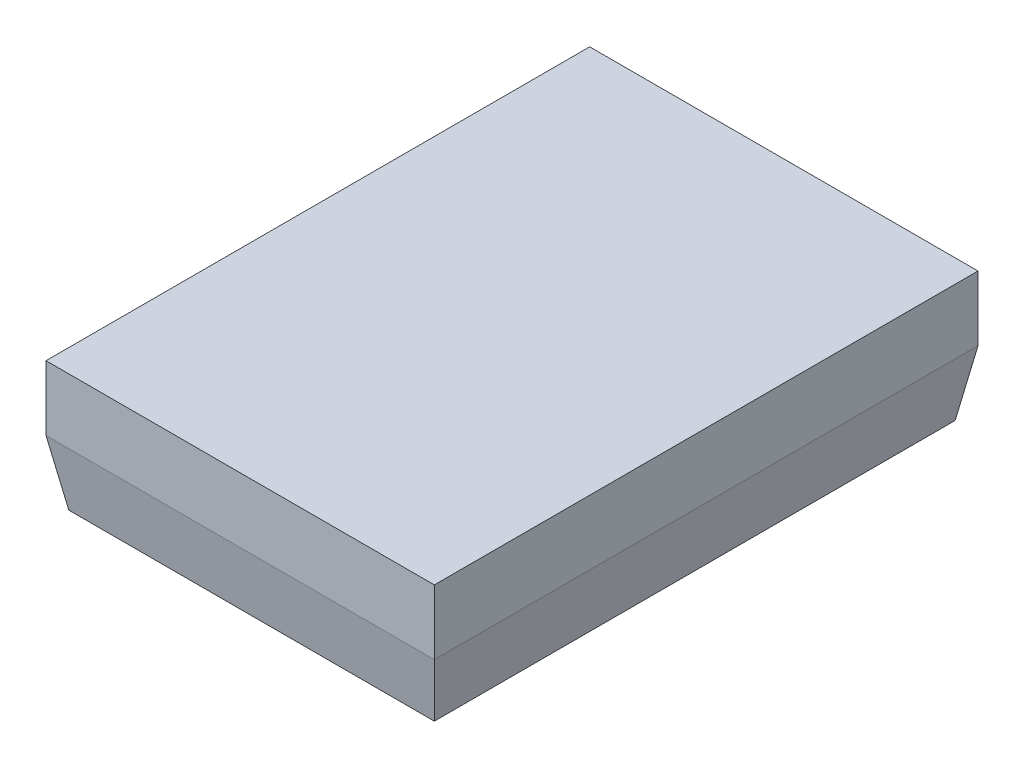
ISO-10303-21;
HEADER;
FILE_DESCRIPTION(('STEP AP214'),'2;1');
FILE_NAME('part.step','',(''),(''),'','','');
FILE_SCHEMA(('AUTOMOTIVE_DESIGN { 1 0 10303 214 1 1 1 1 }'));
ENDSEC;
DATA;
#1=APPLICATION_CONTEXT('core data for automotive mechanical design processes');
#2=APPLICATION_PROTOCOL_DEFINITION('international standard','automotive_design',2000,#1);
#3=PRODUCT_CONTEXT('',#1,'mechanical');
#4=PRODUCT('Part','Part','',(#3));
#5=PRODUCT_RELATED_PRODUCT_CATEGORY('part','',(#4));
#6=PRODUCT_DEFINITION_FORMATION('','',#4);
#7=PRODUCT_DEFINITION_CONTEXT('part definition',#1,'design');
#8=PRODUCT_DEFINITION('design','',#6,#7);
#9=PRODUCT_DEFINITION_SHAPE('','',#8);
#10=(LENGTH_UNIT() NAMED_UNIT(*) SI_UNIT(.MILLI.,.METRE.));
#11=(NAMED_UNIT(*) PLANE_ANGLE_UNIT() SI_UNIT($,.RADIAN.));
#12=(NAMED_UNIT(*) SI_UNIT($,.STERADIAN.) SOLID_ANGLE_UNIT());
#13=UNCERTAINTY_MEASURE_WITH_UNIT(LENGTH_MEASURE(1.E-05),#10,'distance_accuracy_value','');
#14=(GEOMETRIC_REPRESENTATION_CONTEXT(3) GLOBAL_UNCERTAINTY_ASSIGNED_CONTEXT((#13)) GLOBAL_UNIT_ASSIGNED_CONTEXT((#10,
#11,#12)) REPRESENTATION_CONTEXT('',''));
#15=CARTESIAN_POINT('',(0.,0.,0.));
#16=DIRECTION('',(0.,0.,1.));
#17=DIRECTION('',(1.,0.,0.));
#18=AXIS2_PLACEMENT_3D('',#15,#16,#17);
#19=CARTESIAN_POINT('',(15.2,-6.46,13.));
#20=DIRECTION('',(-1.,0.,0.));
#21=DIRECTION('',(0.,0.,1.));
#22=AXIS2_PLACEMENT_3D('',#19,#20,#21);
#23=PLANE('',#22);
#24=DIRECTION('',(0.,0.,1.));
#25=VECTOR('',#24,1.);
#26=CARTESIAN_POINT('',(15.2,-5.21,13.));
#27=LINE('',#26,#25);
#28=CARTESIAN_POINT('',(15.2,-5.21,2.5));
#29=VERTEX_POINT('',#28);
#30=CARTESIAN_POINT('',(15.2,-5.21,13.));
#31=VERTEX_POINT('',#30);
#32=EDGE_CURVE('E11',#29,#31,#27,.T.);
#33=ORIENTED_EDGE('',*,*,#32,.T.);
#34=DIRECTION('',(0.,1.,0.));
#35=VECTOR('',#34,1.);
#36=CARTESIAN_POINT('',(15.2,-6.46,13.));
#37=LINE('',#36,#35);
#38=CARTESIAN_POINT('',(15.2,-6.46,13.));
#39=VERTEX_POINT('',#38);
#40=EDGE_CURVE('E42',#39,#31,#37,.T.);
#41=ORIENTED_EDGE('',*,*,#40,.F.);
#42=DIRECTION('',(0.,0.,1.));
#43=VECTOR('',#42,1.);
#44=CARTESIAN_POINT('',(15.2,-6.46,13.));
#45=LINE('',#44,#43);
#46=CARTESIAN_POINT('',(15.2,-6.46,2.5));
#47=VERTEX_POINT('',#46);
#48=EDGE_CURVE('E20',#47,#39,#45,.T.);
#49=ORIENTED_EDGE('',*,*,#48,.F.);
#50=DIRECTION('',(0.,1.,0.));
#51=VECTOR('',#50,1.);
#52=CARTESIAN_POINT('',(15.2,-6.46,2.5));
#53=LINE('',#52,#51);
#54=EDGE_CURVE('E27',#47,#29,#53,.T.);
#55=ORIENTED_EDGE('',*,*,#54,.T.);
#56=EDGE_LOOP('',(#33,#41,#49,#55));
#57=FACE_BOUND('',#56,.T.);
#58=ADVANCED_FACE('F16',(#57),#23,.F.);
#59=CARTESIAN_POINT('',(7.7,-6.46,13.));
#60=DIRECTION('',(0.,0.,-1.));
#61=DIRECTION('',(0.,-1.,0.));
#62=AXIS2_PLACEMENT_3D('',#59,#60,#61);
#63=PLANE('',#62);
#64=DIRECTION('',(-1.,0.,0.));
#65=VECTOR('',#64,1.);
#66=CARTESIAN_POINT('',(7.7,-5.21,13.));
#67=LINE('',#66,#65);
#68=CARTESIAN_POINT('',(7.7,-5.21,13.));
#69=VERTEX_POINT('',#68);
#70=EDGE_CURVE('E123',#31,#69,#67,.T.);
#71=ORIENTED_EDGE('',*,*,#70,.T.);
#72=DIRECTION('',(0.,1.,0.));
#73=VECTOR('',#72,1.);
#74=CARTESIAN_POINT('',(7.7,-6.46,13.));
#75=LINE('',#74,#73);
#76=CARTESIAN_POINT('',(7.7,-6.46,13.));
#77=VERTEX_POINT('',#76);
#78=EDGE_CURVE('E150',#77,#69,#75,.T.);
#79=ORIENTED_EDGE('',*,*,#78,.F.);
#80=DIRECTION('',(-1.,0.,0.));
#81=VECTOR('',#80,1.);
#82=CARTESIAN_POINT('',(7.7,-6.46,13.));
#83=LINE('',#82,#81);
#84=EDGE_CURVE('E127',#39,#77,#83,.T.);
#85=ORIENTED_EDGE('',*,*,#84,.F.);
#86=ORIENTED_EDGE('',*,*,#40,.T.);
#87=EDGE_LOOP('',(#71,#79,#85,#86));
#88=FACE_BOUND('',#87,.T.);
#89=ADVANCED_FACE('F235',(#88),#63,.F.);
#90=CARTESIAN_POINT('',(7.7,-6.46,13.));
#91=DIRECTION('',(1.,0.,0.));
#92=DIRECTION('',(0.,0.,1.));
#93=AXIS2_PLACEMENT_3D('',#90,#91,#92);
#94=PLANE('',#93);
#95=DIRECTION('',(0.,0.,-1.));
#96=VECTOR('',#95,1.);
#97=CARTESIAN_POINT('',(7.7,-5.21,13.));
#98=LINE('',#97,#96);
#99=CARTESIAN_POINT('',(7.7,-5.21,2.5));
#100=VERTEX_POINT('',#99);
#101=EDGE_CURVE('E146',#69,#100,#98,.T.);
#102=ORIENTED_EDGE('',*,*,#101,.T.);
#103=DIRECTION('',(0.,1.,0.));
#104=VECTOR('',#103,1.);
#105=CARTESIAN_POINT('',(7.7,-6.46,2.5));
#106=LINE('',#105,#104);
#107=CARTESIAN_POINT('',(7.7,-6.46,2.5));
#108=VERTEX_POINT('',#107);
#109=EDGE_CURVE('E116',#108,#100,#106,.T.);
#110=ORIENTED_EDGE('',*,*,#109,.F.);
#111=DIRECTION('',(0.,0.,-1.));
#112=VECTOR('',#111,1.);
#113=CARTESIAN_POINT('',(7.7,-6.46,13.));
#114=LINE('',#113,#112);
#115=EDGE_CURVE('E139',#77,#108,#114,.T.);
#116=ORIENTED_EDGE('',*,*,#115,.F.);
#117=ORIENTED_EDGE('',*,*,#78,.T.);
#118=EDGE_LOOP('',(#102,#110,#116,#117));
#119=FACE_BOUND('',#118,.T.);
#120=ADVANCED_FACE('F239',(#119),#94,.F.);
#121=CARTESIAN_POINT('',(7.7,-6.46,2.5));
#122=DIRECTION('',(0.,0.,1.));
#123=DIRECTION('',(1.,0.,0.));
#124=AXIS2_PLACEMENT_3D('',#121,#122,#123);
#125=PLANE('',#124);
#126=DIRECTION('',(1.,0.,0.));
#127=VECTOR('',#126,1.);
#128=CARTESIAN_POINT('',(7.7,-5.21,2.5));
#129=LINE('',#128,#127);
#130=EDGE_CURVE('E121',#100,#29,#129,.T.);
#131=ORIENTED_EDGE('',*,*,#130,.T.);
#132=ORIENTED_EDGE('',*,*,#54,.F.);
#133=DIRECTION('',(1.,0.,0.));
#134=VECTOR('',#133,1.);
#135=CARTESIAN_POINT('',(7.7,-6.46,2.5));
#136=LINE('',#135,#134);
#137=EDGE_CURVE('E110',#108,#47,#136,.T.);
#138=ORIENTED_EDGE('',*,*,#137,.F.);
#139=ORIENTED_EDGE('',*,*,#109,.T.);
#140=EDGE_LOOP('',(#131,#132,#138,#139));
#141=FACE_BOUND('',#140,.T.);
#142=ADVANCED_FACE('F119',(#141),#125,.F.);
#143=CARTESIAN_POINT('',(0.,-5.21,0.));
#144=DIRECTION('',(0.,-1.,0.));
#145=DIRECTION('',(0.,0.,-1.));
#146=AXIS2_PLACEMENT_3D('',#143,#144,#145);
#147=PLANE('',#146);
#148=ORIENTED_EDGE('',*,*,#32,.F.);
#149=ORIENTED_EDGE('',*,*,#130,.F.);
#150=ORIENTED_EDGE('',*,*,#101,.F.);
#151=ORIENTED_EDGE('',*,*,#70,.F.);
#152=EDGE_LOOP('',(#148,#149,#150,#151));
#153=FACE_BOUND('',#152,.T.);
#154=ADVANCED_FACE('F244',(#153),#147,.F.);
#155=CARTESIAN_POINT('',(7.7,-6.46,2.5));
#156=DIRECTION('',(0.,-0.17364817766693,-0.984807753012208));
#157=DIRECTION('',(0.,-0.984807753012208,0.17364817766693));
#158=AXIS2_PLACEMENT_3D('',#155,#156,#157);
#159=PLANE('',#158);
#160=ORIENTED_EDGE('',*,*,#137,.T.);
#161=DIRECTION('',(0.171087869746036,0.970287525247814,-0.171087869746036));
#162=VECTOR('',#161,1.);
#163=CARTESIAN_POINT('',(15.2,-6.46,2.5));
#164=LINE('',#163,#162);
#165=CARTESIAN_POINT('',(14.9795912741144,-7.71,2.72040872588558));
#166=VERTEX_POINT('',#165);
#167=EDGE_CURVE('E105',#166,#47,#164,.T.);
#168=ORIENTED_EDGE('',*,*,#167,.F.);
#169=DIRECTION('',(1.,0.,0.));
#170=VECTOR('',#169,1.);
#171=CARTESIAN_POINT('',(7.7,-7.71,2.72040872588558));
#172=LINE('',#171,#170);
#173=CARTESIAN_POINT('',(7.92040872588561,-7.71,2.72040872588558));
#174=VERTEX_POINT('',#173);
#175=EDGE_CURVE('E140',#174,#166,#172,.T.);
#176=ORIENTED_EDGE('',*,*,#175,.F.);
#177=DIRECTION('',(-0.171087869746036,0.970287525247814,-0.171087869746036));
#178=VECTOR('',#177,1.);
#179=CARTESIAN_POINT('',(7.7,-6.46,2.5));
#180=LINE('',#179,#178);
#181=EDGE_CURVE('E104',#174,#108,#180,.T.);
#182=ORIENTED_EDGE('',*,*,#181,.T.);
#183=EDGE_LOOP('',(#160,#168,#176,#182));
#184=FACE_BOUND('',#183,.T.);
#185=ADVANCED_FACE('F111',(#184),#159,.T.);
#186=CARTESIAN_POINT('',(15.2,-6.46,2.5));
#187=DIRECTION('',(0.984807753012208,-0.17364817766693,0.));
#188=DIRECTION('',(0.,0.,-1.));
#189=AXIS2_PLACEMENT_3D('',#186,#187,#188);
#190=PLANE('',#189);
#191=ORIENTED_EDGE('',*,*,#48,.T.);
#192=DIRECTION('',(0.171087869746036,0.970287525247814,0.171087869746036));
#193=VECTOR('',#192,1.);
#194=CARTESIAN_POINT('',(15.2,-6.46,13.));
#195=LINE('',#194,#193);
#196=CARTESIAN_POINT('',(14.9795912741144,-7.71,12.7795912741144));
#197=VERTEX_POINT('',#196);
#198=EDGE_CURVE('E133',#197,#39,#195,.T.);
#199=ORIENTED_EDGE('',*,*,#198,.F.);
#200=DIRECTION('',(0.,0.,1.));
#201=VECTOR('',#200,1.);
#202=CARTESIAN_POINT('',(14.9795912741144,-7.71,2.5));
#203=LINE('',#202,#201);
#204=EDGE_CURVE('E83',#166,#197,#203,.T.);
#205=ORIENTED_EDGE('',*,*,#204,.F.);
#206=ORIENTED_EDGE('',*,*,#167,.T.);
#207=EDGE_LOOP('',(#191,#199,#205,#206));
#208=FACE_BOUND('',#207,.T.);
#209=ADVANCED_FACE('F125',(#208),#190,.T.);
#210=CARTESIAN_POINT('',(15.2,-6.46,13.));
#211=DIRECTION('',(0.,-0.17364817766693,0.984807753012208));
#212=DIRECTION('',(-1.,0.,0.));
#213=AXIS2_PLACEMENT_3D('',#210,#211,#212);
#214=PLANE('',#213);
#215=ORIENTED_EDGE('',*,*,#84,.T.);
#216=DIRECTION('',(-0.171087869746036,0.970287525247814,0.171087869746036));
#217=VECTOR('',#216,1.);
#218=CARTESIAN_POINT('',(7.7,-6.46,13.));
#219=LINE('',#218,#217);
#220=CARTESIAN_POINT('',(7.92040872588561,-7.71,12.7795912741144));
#221=VERTEX_POINT('',#220);
#222=EDGE_CURVE('E136',#221,#77,#219,.T.);
#223=ORIENTED_EDGE('',*,*,#222,.F.);
#224=DIRECTION('',(-1.,0.,0.));
#225=VECTOR('',#224,1.);
#226=CARTESIAN_POINT('',(15.2,-7.71,12.7795912741144));
#227=LINE('',#226,#225);
#228=EDGE_CURVE('E74',#197,#221,#227,.T.);
#229=ORIENTED_EDGE('',*,*,#228,.F.);
#230=ORIENTED_EDGE('',*,*,#198,.T.);
#231=EDGE_LOOP('',(#215,#223,#229,#230));
#232=FACE_BOUND('',#231,.T.);
#233=ADVANCED_FACE('F257',(#232),#214,.T.);
#234=CARTESIAN_POINT('',(7.7,-6.46,13.));
#235=DIRECTION('',(-0.984807753012208,-0.17364817766693,0.));
#236=DIRECTION('',(-0.17364817766693,0.984807753012208,0.));
#237=AXIS2_PLACEMENT_3D('',#234,#235,#236);
#238=PLANE('',#237);
#239=ORIENTED_EDGE('',*,*,#115,.T.);
#240=ORIENTED_EDGE('',*,*,#181,.F.);
#241=DIRECTION('',(0.,0.,-1.));
#242=VECTOR('',#241,1.);
#243=CARTESIAN_POINT('',(7.92040872588561,-7.71,13.));
#244=LINE('',#243,#242);
#245=EDGE_CURVE('E145',#221,#174,#244,.T.);
#246=ORIENTED_EDGE('',*,*,#245,.F.);
#247=ORIENTED_EDGE('',*,*,#222,.T.);
#248=EDGE_LOOP('',(#239,#240,#246,#247));
#249=FACE_BOUND('',#248,.T.);
#250=ADVANCED_FACE('F253',(#249),#238,.T.);
#251=CARTESIAN_POINT('',(0.,-7.71,0.));
#252=DIRECTION('',(0.,-1.,0.));
#253=DIRECTION('',(0.,0.,-1.));
#254=AXIS2_PLACEMENT_3D('',#251,#252,#253);
#255=PLANE('',#254);
#256=ORIENTED_EDGE('',*,*,#175,.T.);
#257=ORIENTED_EDGE('',*,*,#204,.T.);
#258=ORIENTED_EDGE('',*,*,#228,.T.);
#259=ORIENTED_EDGE('',*,*,#245,.T.);
#260=EDGE_LOOP('',(#256,#257,#258,#259));
#261=FACE_BOUND('',#260,.T.);
#262=ADVANCED_FACE('F18',(#261),#255,.T.);
#263=CLOSED_SHELL('',(#58,#89,#120,#142,#154,#185,#209,#233,#250,#262));
#264=MANIFOLD_SOLID_BREP('B1',#263);
#265=ADVANCED_BREP_SHAPE_REPRESENTATION('',(#18,#264),#14);
#266=SHAPE_DEFINITION_REPRESENTATION(#9,#265);
ENDSEC;
END-ISO-10303-21;
